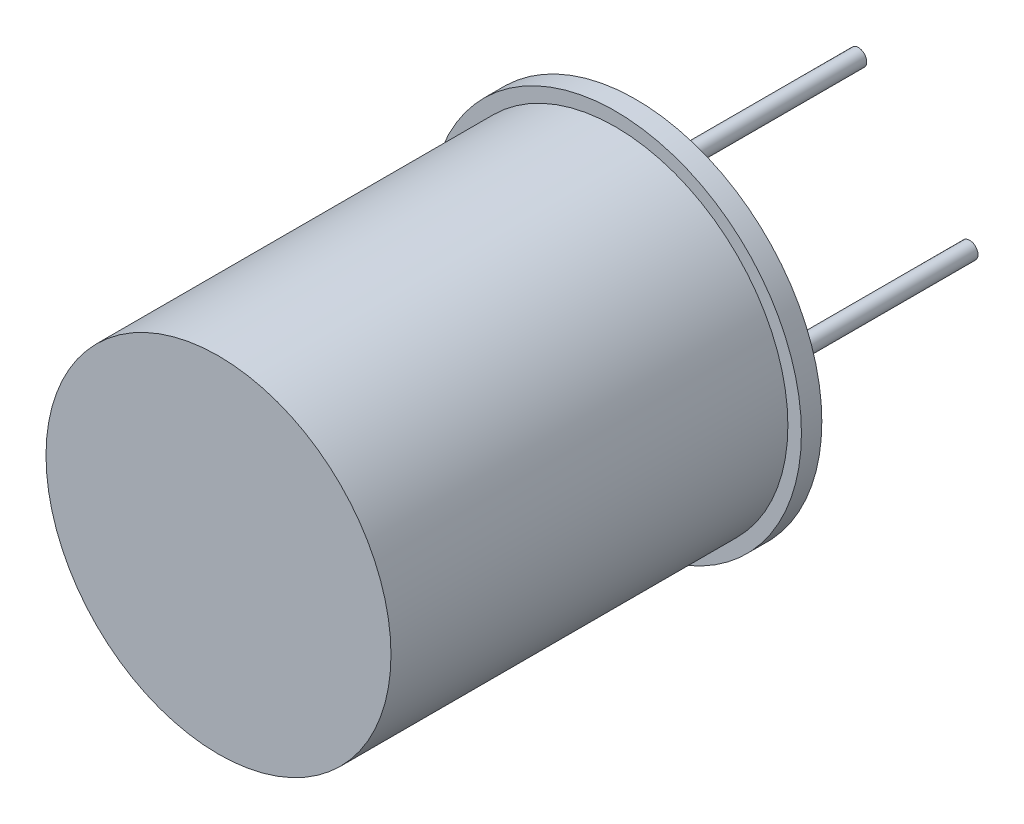
ISO-10303-21;
HEADER;
FILE_DESCRIPTION(('STEP AP214'),'2;1');
FILE_NAME('part.step','',(''),(''),'','','');
FILE_SCHEMA(('AUTOMOTIVE_DESIGN { 1 0 10303 214 1 1 1 1 }'));
ENDSEC;
DATA;
#1=APPLICATION_CONTEXT('core data for automotive mechanical design processes');
#2=APPLICATION_PROTOCOL_DEFINITION('international standard','automotive_design',2000,#1);
#3=PRODUCT_CONTEXT('',#1,'mechanical');
#4=PRODUCT('Part','Part','',(#3));
#5=PRODUCT_RELATED_PRODUCT_CATEGORY('part','',(#4));
#6=PRODUCT_DEFINITION_FORMATION('','',#4);
#7=PRODUCT_DEFINITION_CONTEXT('part definition',#1,'design');
#8=PRODUCT_DEFINITION('design','',#6,#7);
#9=PRODUCT_DEFINITION_SHAPE('','',#8);
#10=(LENGTH_UNIT() NAMED_UNIT(*) SI_UNIT(.MILLI.,.METRE.));
#11=(NAMED_UNIT(*) PLANE_ANGLE_UNIT() SI_UNIT($,.RADIAN.));
#12=(NAMED_UNIT(*) SI_UNIT($,.STERADIAN.) SOLID_ANGLE_UNIT());
#13=UNCERTAINTY_MEASURE_WITH_UNIT(LENGTH_MEASURE(1.E-05),#10,'distance_accuracy_value','');
#14=(GEOMETRIC_REPRESENTATION_CONTEXT(3) GLOBAL_UNCERTAINTY_ASSIGNED_CONTEXT((#13)) GLOBAL_UNIT_ASSIGNED_CONTEXT((#10,
#11,#12)) REPRESENTATION_CONTEXT('',''));
#15=CARTESIAN_POINT('',(0.,0.,0.));
#16=DIRECTION('',(0.,0.,1.));
#17=DIRECTION('',(1.,0.,0.));
#18=AXIS2_PLACEMENT_3D('',#15,#16,#17);
#19=CARTESIAN_POINT('',(0.,0.,11.25));
#20=DIRECTION('',(0.,0.,1.));
#21=DIRECTION('',(1.,0.,0.));
#22=AXIS2_PLACEMENT_3D('',#19,#20,#21);
#23=PLANE('',#22);
#24=CARTESIAN_POINT('',(0.,0.,11.25));
#25=DIRECTION('',(0.,0.,1.));
#26=DIRECTION('',(1.,0.,0.));
#27=AXIS2_PLACEMENT_3D('',#24,#25,#26);
#28=CIRCLE('',#27,4.65);
#29=CARTESIAN_POINT('',(4.65,0.,11.25));
#30=VERTEX_POINT('',#29);
#31=EDGE_CURVE('E10',#30,#30,#28,.T.);
#32=ORIENTED_EDGE('',*,*,#31,.T.);
#33=EDGE_LOOP('',(#32));
#34=FACE_BOUND('',#33,.T.);
#35=ADVANCED_FACE('F16',(#34),#23,.T.);
#36=CARTESIAN_POINT('',(0.,0.,0.));
#37=DIRECTION('',(0.,0.,-1.));
#38=DIRECTION('',(1.,0.,0.));
#39=AXIS2_PLACEMENT_3D('',#36,#37,#38);
#40=CYLINDRICAL_SURFACE('',#39,4.65);
#41=DIRECTION('',(0.,0.,-1.));
#42=VECTOR('',#41,1.);
#43=CARTESIAN_POINT('',(4.65,0.,11.25));
#44=LINE('',#43,#42);
#45=CARTESIAN_POINT('',(4.65,0.,0.55));
#46=VERTEX_POINT('',#45);
#47=EDGE_CURVE('E26',#30,#46,#44,.T.);
#48=ORIENTED_EDGE('',*,*,#47,.F.);
#49=ORIENTED_EDGE('',*,*,#31,.F.);
#50=ORIENTED_EDGE('',*,*,#47,.T.);
#51=CARTESIAN_POINT('',(0.,0.,0.55));
#52=DIRECTION('',(0.,0.,-1.));
#53=DIRECTION('',(1.,0.,0.));
#54=AXIS2_PLACEMENT_3D('',#51,#52,#53);
#55=CIRCLE('',#54,4.65);
#56=EDGE_CURVE('E77',#46,#46,#55,.T.);
#57=ORIENTED_EDGE('',*,*,#56,.F.);
#58=EDGE_LOOP('',(#48,#49,#50,#57));
#59=FACE_BOUND('',#58,.T.);
#60=ADVANCED_FACE('F18',(#59),#40,.T.);
#61=CARTESIAN_POINT('',(0.,3.,-6.));
#62=DIRECTION('',(0.,0.,1.));
#63=DIRECTION('',(1.,0.,0.));
#64=AXIS2_PLACEMENT_3D('',#61,#62,#63);
#65=PLANE('',#64);
#66=CARTESIAN_POINT('',(0.,3.,-6.));
#67=DIRECTION('',(0.,0.,1.));
#68=DIRECTION('',(1.,0.,0.));
#69=AXIS2_PLACEMENT_3D('',#66,#67,#68);
#70=CIRCLE('',#69,0.225);
#71=CARTESIAN_POINT('',(0.225,3.,-6.));
#72=VERTEX_POINT('',#71);
#73=EDGE_CURVE('E71',#72,#72,#70,.T.);
#74=ORIENTED_EDGE('',*,*,#73,.F.);
#75=EDGE_LOOP('',(#74));
#76=FACE_BOUND('',#75,.T.);
#77=ADVANCED_FACE('F134',(#76),#65,.F.);
#78=CARTESIAN_POINT('',(3.,0.,-6.));
#79=DIRECTION('',(0.,0.,1.));
#80=DIRECTION('',(1.,0.,0.));
#81=AXIS2_PLACEMENT_3D('',#78,#79,#80);
#82=PLANE('',#81);
#83=CARTESIAN_POINT('',(3.,0.,-6.));
#84=DIRECTION('',(0.,0.,1.));
#85=DIRECTION('',(1.,0.,0.));
#86=AXIS2_PLACEMENT_3D('',#83,#84,#85);
#87=CIRCLE('',#86,0.225);
#88=CARTESIAN_POINT('',(3.225,0.,-6.));
#89=VERTEX_POINT('',#88);
#90=EDGE_CURVE('E85',#89,#89,#87,.T.);
#91=ORIENTED_EDGE('',*,*,#90,.F.);
#92=EDGE_LOOP('',(#91));
#93=FACE_BOUND('',#92,.T.);
#94=ADVANCED_FACE('F131',(#93),#82,.F.);
#95=CARTESIAN_POINT('',(-3.,0.,-6.));
#96=DIRECTION('',(0.,0.,1.));
#97=DIRECTION('',(1.,0.,0.));
#98=AXIS2_PLACEMENT_3D('',#95,#96,#97);
#99=PLANE('',#98);
#100=CARTESIAN_POINT('',(-3.,0.,-6.));
#101=DIRECTION('',(0.,0.,1.));
#102=DIRECTION('',(1.,0.,0.));
#103=AXIS2_PLACEMENT_3D('',#100,#101,#102);
#104=CIRCLE('',#103,0.225);
#105=CARTESIAN_POINT('',(-2.775,0.,-6.));
#106=VERTEX_POINT('',#105);
#107=EDGE_CURVE('E120',#106,#106,#104,.T.);
#108=ORIENTED_EDGE('',*,*,#107,.F.);
#109=EDGE_LOOP('',(#108));
#110=FACE_BOUND('',#109,.T.);
#111=ADVANCED_FACE('F133',(#110),#99,.F.);
#112=CARTESIAN_POINT('',(0.,-3.,-6.));
#113=DIRECTION('',(0.,0.,1.));
#114=DIRECTION('',(1.,0.,0.));
#115=AXIS2_PLACEMENT_3D('',#112,#113,#114);
#116=PLANE('',#115);
#117=CARTESIAN_POINT('',(0.,-3.,-6.));
#118=DIRECTION('',(0.,0.,1.));
#119=DIRECTION('',(1.,0.,0.));
#120=AXIS2_PLACEMENT_3D('',#117,#118,#119);
#121=CIRCLE('',#120,0.225);
#122=CARTESIAN_POINT('',(0.225,-3.,-6.));
#123=VERTEX_POINT('',#122);
#124=EDGE_CURVE('E111',#123,#123,#121,.T.);
#125=ORIENTED_EDGE('',*,*,#124,.F.);
#126=EDGE_LOOP('',(#125));
#127=FACE_BOUND('',#126,.T.);
#128=ADVANCED_FACE('F96',(#127),#116,.F.);
#129=CARTESIAN_POINT('',(0.,0.,0.55));
#130=DIRECTION('',(0.,0.,1.));
#131=DIRECTION('',(1.,0.,0.));
#132=AXIS2_PLACEMENT_3D('',#129,#130,#131);
#133=PLANE('',#132);
#134=ORIENTED_EDGE('',*,*,#56,.T.);
#135=EDGE_LOOP('',(#134));
#136=FACE_BOUND('',#135,.T.);
#137=CARTESIAN_POINT('',(0.,0.,0.55));
#138=DIRECTION('',(0.,0.,1.));
#139=DIRECTION('',(1.,0.,0.));
#140=AXIS2_PLACEMENT_3D('',#137,#138,#139);
#141=CIRCLE('',#140,5.015);
#142=CARTESIAN_POINT('',(5.015,0.,0.55));
#143=VERTEX_POINT('',#142);
#144=EDGE_CURVE('E99',#143,#143,#141,.T.);
#145=ORIENTED_EDGE('',*,*,#144,.T.);
#146=EDGE_LOOP('',(#145));
#147=FACE_BOUND('',#146,.T.);
#148=ADVANCED_FACE('F93',(#136,#147),#133,.T.);
#149=CARTESIAN_POINT('',(0.,3.,-6.));
#150=DIRECTION('',(0.,0.,-1.));
#151=DIRECTION('',(1.,0.,0.));
#152=AXIS2_PLACEMENT_3D('',#149,#150,#151);
#153=CYLINDRICAL_SURFACE('',#152,0.225);
#154=DIRECTION('',(0.,0.,1.));
#155=VECTOR('',#154,1.);
#156=CARTESIAN_POINT('',(0.225,3.,-6.));
#157=LINE('',#156,#155);
#158=CARTESIAN_POINT('',(0.225,3.,0.));
#159=VERTEX_POINT('',#158);
#160=EDGE_CURVE('E74',#72,#159,#157,.T.);
#161=ORIENTED_EDGE('',*,*,#160,.T.);
#162=CARTESIAN_POINT('',(0.,3.,0.));
#163=DIRECTION('',(0.,0.,-1.));
#164=DIRECTION('',(1.,0.,0.));
#165=AXIS2_PLACEMENT_3D('',#162,#163,#164);
#166=CIRCLE('',#165,0.225);
#167=EDGE_CURVE('E113',#159,#159,#166,.T.);
#168=ORIENTED_EDGE('',*,*,#167,.T.);
#169=ORIENTED_EDGE('',*,*,#160,.F.);
#170=ORIENTED_EDGE('',*,*,#73,.T.);
#171=EDGE_LOOP('',(#161,#168,#169,#170));
#172=FACE_BOUND('',#171,.T.);
#173=ADVANCED_FACE('F72',(#172),#153,.T.);
#174=CARTESIAN_POINT('',(3.,0.,-6.));
#175=DIRECTION('',(0.,0.,-1.));
#176=DIRECTION('',(1.,0.,0.));
#177=AXIS2_PLACEMENT_3D('',#174,#175,#176);
#178=CYLINDRICAL_SURFACE('',#177,0.225);
#179=DIRECTION('',(0.,0.,1.));
#180=VECTOR('',#179,1.);
#181=CARTESIAN_POINT('',(3.225,0.,-6.));
#182=LINE('',#181,#180);
#183=CARTESIAN_POINT('',(3.225,0.,0.));
#184=VERTEX_POINT('',#183);
#185=EDGE_CURVE('E117',#89,#184,#182,.T.);
#186=ORIENTED_EDGE('',*,*,#185,.T.);
#187=CARTESIAN_POINT('',(3.,0.,0.));
#188=DIRECTION('',(0.,0.,-1.));
#189=DIRECTION('',(1.,0.,0.));
#190=AXIS2_PLACEMENT_3D('',#187,#188,#189);
#191=CIRCLE('',#190,0.225);
#192=EDGE_CURVE('E196',#184,#184,#191,.T.);
#193=ORIENTED_EDGE('',*,*,#192,.T.);
#194=ORIENTED_EDGE('',*,*,#185,.F.);
#195=ORIENTED_EDGE('',*,*,#90,.T.);
#196=EDGE_LOOP('',(#186,#193,#194,#195));
#197=FACE_BOUND('',#196,.T.);
#198=ADVANCED_FACE('F128',(#197),#178,.T.);
#199=CARTESIAN_POINT('',(-3.,0.,-6.));
#200=DIRECTION('',(0.,0.,-1.));
#201=DIRECTION('',(1.,0.,0.));
#202=AXIS2_PLACEMENT_3D('',#199,#200,#201);
#203=CYLINDRICAL_SURFACE('',#202,0.225);
#204=DIRECTION('',(0.,0.,1.));
#205=VECTOR('',#204,1.);
#206=CARTESIAN_POINT('',(-2.775,0.,-6.));
#207=LINE('',#206,#205);
#208=CARTESIAN_POINT('',(-2.775,0.,0.));
#209=VERTEX_POINT('',#208);
#210=EDGE_CURVE('E122',#106,#209,#207,.T.);
#211=ORIENTED_EDGE('',*,*,#210,.T.);
#212=CARTESIAN_POINT('',(-3.,0.,0.));
#213=DIRECTION('',(0.,0.,-1.));
#214=DIRECTION('',(1.,0.,0.));
#215=AXIS2_PLACEMENT_3D('',#212,#213,#214);
#216=CIRCLE('',#215,0.225);
#217=EDGE_CURVE('E194',#209,#209,#216,.T.);
#218=ORIENTED_EDGE('',*,*,#217,.T.);
#219=ORIENTED_EDGE('',*,*,#210,.F.);
#220=ORIENTED_EDGE('',*,*,#107,.T.);
#221=EDGE_LOOP('',(#211,#218,#219,#220));
#222=FACE_BOUND('',#221,.T.);
#223=ADVANCED_FACE('F155',(#222),#203,.T.);
#224=CARTESIAN_POINT('',(0.,-3.,-6.));
#225=DIRECTION('',(0.,0.,-1.));
#226=DIRECTION('',(1.,0.,0.));
#227=AXIS2_PLACEMENT_3D('',#224,#225,#226);
#228=CYLINDRICAL_SURFACE('',#227,0.225);
#229=DIRECTION('',(0.,0.,1.));
#230=VECTOR('',#229,1.);
#231=CARTESIAN_POINT('',(0.225,-3.,-6.));
#232=LINE('',#231,#230);
#233=CARTESIAN_POINT('',(0.225,-3.,0.));
#234=VERTEX_POINT('',#233);
#235=EDGE_CURVE('E104',#123,#234,#232,.T.);
#236=ORIENTED_EDGE('',*,*,#235,.T.);
#237=CARTESIAN_POINT('',(0.,-3.,0.));
#238=DIRECTION('',(0.,0.,-1.));
#239=DIRECTION('',(1.,0.,0.));
#240=AXIS2_PLACEMENT_3D('',#237,#238,#239);
#241=CIRCLE('',#240,0.225);
#242=EDGE_CURVE('E169',#234,#234,#241,.T.);
#243=ORIENTED_EDGE('',*,*,#242,.T.);
#244=ORIENTED_EDGE('',*,*,#235,.F.);
#245=ORIENTED_EDGE('',*,*,#124,.T.);
#246=EDGE_LOOP('',(#236,#243,#244,#245));
#247=FACE_BOUND('',#246,.T.);
#248=ADVANCED_FACE('F151',(#247),#228,.T.);
#249=CARTESIAN_POINT('',(0.,0.,0.));
#250=DIRECTION('',(0.,0.,-1.));
#251=DIRECTION('',(1.,0.,0.));
#252=AXIS2_PLACEMENT_3D('',#249,#250,#251);
#253=CYLINDRICAL_SURFACE('',#252,5.015);
#254=CARTESIAN_POINT('',(0.,0.,0.));
#255=DIRECTION('',(0.,0.,1.));
#256=DIRECTION('',(1.,0.,0.));
#257=AXIS2_PLACEMENT_3D('',#254,#255,#256);
#258=CIRCLE('',#257,5.015);
#259=CARTESIAN_POINT('',(5.015,0.,0.));
#260=VERTEX_POINT('',#259);
#261=EDGE_CURVE('E189',#260,#260,#258,.T.);
#262=ORIENTED_EDGE('',*,*,#261,.T.);
#263=DIRECTION('',(0.,0.,1.));
#264=VECTOR('',#263,1.);
#265=CARTESIAN_POINT('',(5.015,0.,0.));
#266=LINE('',#265,#264);
#267=EDGE_CURVE('E105',#260,#143,#266,.T.);
#268=ORIENTED_EDGE('',*,*,#267,.T.);
#269=ORIENTED_EDGE('',*,*,#144,.F.);
#270=ORIENTED_EDGE('',*,*,#267,.F.);
#271=EDGE_LOOP('',(#262,#268,#269,#270));
#272=FACE_BOUND('',#271,.T.);
#273=ADVANCED_FACE('F206',(#272),#253,.T.);
#274=CARTESIAN_POINT('',(0.,0.,0.));
#275=DIRECTION('',(0.,0.,1.));
#276=DIRECTION('',(1.,0.,0.));
#277=AXIS2_PLACEMENT_3D('',#274,#275,#276);
#278=PLANE('',#277);
#279=ORIENTED_EDGE('',*,*,#167,.F.);
#280=EDGE_LOOP('',(#279));
#281=FACE_BOUND('',#280,.T.);
#282=ORIENTED_EDGE('',*,*,#192,.F.);
#283=EDGE_LOOP('',(#282));
#284=FACE_BOUND('',#283,.T.);
#285=ORIENTED_EDGE('',*,*,#217,.F.);
#286=EDGE_LOOP('',(#285));
#287=FACE_BOUND('',#286,.T.);
#288=ORIENTED_EDGE('',*,*,#242,.F.);
#289=EDGE_LOOP('',(#288));
#290=FACE_BOUND('',#289,.T.);
#291=ORIENTED_EDGE('',*,*,#261,.F.);
#292=EDGE_LOOP('',(#291));
#293=FACE_BOUND('',#292,.T.);
#294=ADVANCED_FACE('F203',(#281,#284,#287,#290,#293),#278,.F.);
#295=CLOSED_SHELL('',(#35,#60,#77,#94,#111,#128,#148,#173,#198,#223,#248,#273,#294));
#296=MANIFOLD_SOLID_BREP('B1',#295);
#297=ADVANCED_BREP_SHAPE_REPRESENTATION('',(#18,#296),#14);
#298=SHAPE_DEFINITION_REPRESENTATION(#9,#297);
ENDSEC;
END-ISO-10303-21;
